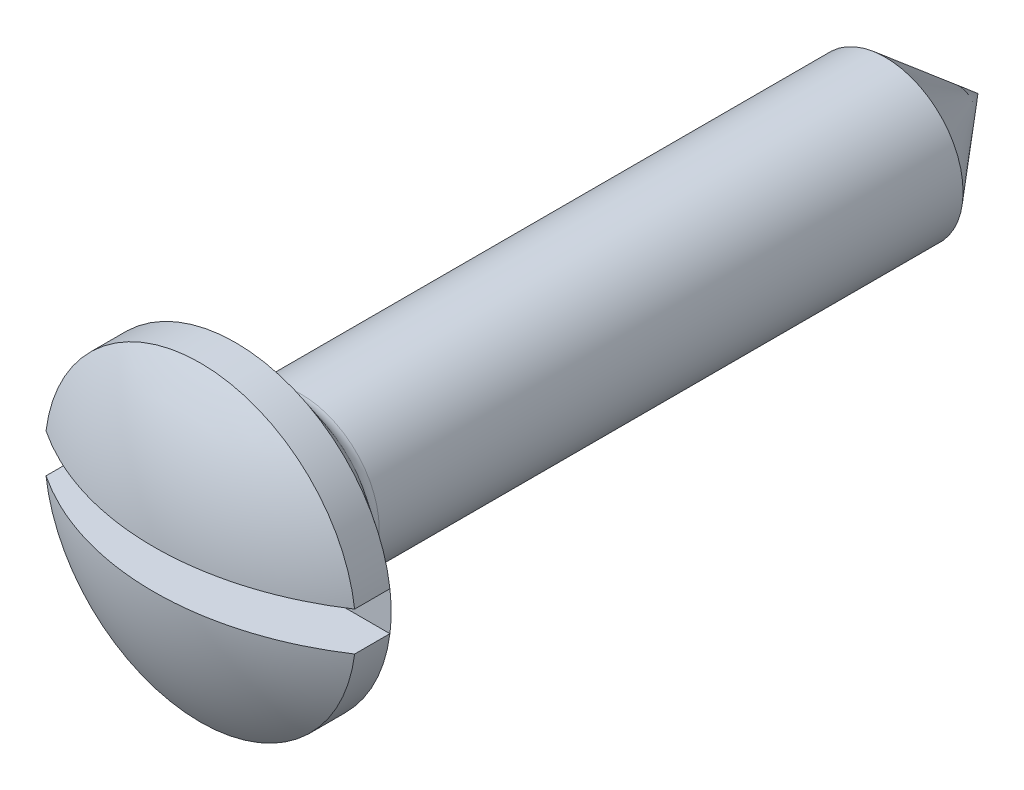
ISO-10303-21;
HEADER;
FILE_DESCRIPTION(('STEP AP214'),'2;1');
FILE_NAME('part.step','',(''),(''),'','','');
FILE_SCHEMA(('AUTOMOTIVE_DESIGN { 1 0 10303 214 1 1 1 1 }'));
ENDSEC;
DATA;
#1=APPLICATION_CONTEXT('core data for automotive mechanical design processes');
#2=APPLICATION_PROTOCOL_DEFINITION('international standard','automotive_design',2000,#1);
#3=PRODUCT_CONTEXT('',#1,'mechanical');
#4=PRODUCT('Part','Part','',(#3));
#5=PRODUCT_RELATED_PRODUCT_CATEGORY('part','',(#4));
#6=PRODUCT_DEFINITION_FORMATION('','',#4);
#7=PRODUCT_DEFINITION_CONTEXT('part definition',#1,'design');
#8=PRODUCT_DEFINITION('design','',#6,#7);
#9=PRODUCT_DEFINITION_SHAPE('','',#8);
#10=(LENGTH_UNIT() NAMED_UNIT(*) SI_UNIT(.MILLI.,.METRE.));
#11=(NAMED_UNIT(*) PLANE_ANGLE_UNIT() SI_UNIT($,.RADIAN.));
#12=(NAMED_UNIT(*) SI_UNIT($,.STERADIAN.) SOLID_ANGLE_UNIT());
#13=UNCERTAINTY_MEASURE_WITH_UNIT(LENGTH_MEASURE(1.E-05),#10,'distance_accuracy_value','');
#14=(GEOMETRIC_REPRESENTATION_CONTEXT(3) GLOBAL_UNCERTAINTY_ASSIGNED_CONTEXT((#13)) GLOBAL_UNIT_ASSIGNED_CONTEXT((#10,
#11,#12)) REPRESENTATION_CONTEXT('',''));
#15=CARTESIAN_POINT('',(0.,0.,0.));
#16=DIRECTION('',(0.,0.,1.));
#17=DIRECTION('',(1.,0.,0.));
#18=AXIS2_PLACEMENT_3D('',#15,#16,#17);
#19=CARTESIAN_POINT('',(0.,0.,-3.6));
#20=DIRECTION('',(0.,0.,1.));
#21=DIRECTION('',(0.,1.,0.));
#22=AXIS2_PLACEMENT_3D('',#19,#20,#21);
#23=SPHERICAL_SURFACE('',#22,3.6);
#24=CARTESIAN_POINT('',(0.,0.,-0.606674090580846));
#25=DIRECTION('',(0.,0.,1.));
#26=DIRECTION('',(1.,0.,0.));
#27=AXIS2_PLACEMENT_3D('',#24,#25,#26);
#28=CIRCLE('',#27,2.);
#29=CARTESIAN_POINT('',(1.98431348329844,0.250000000000002,-0.606674090580846));
#30=VERTEX_POINT('',#29);
#31=CARTESIAN_POINT('',(-1.98431348329844,0.250000000000001,-0.606674090580846));
#32=VERTEX_POINT('',#31);
#33=EDGE_CURVE('E11',#30,#32,#28,.T.);
#34=ORIENTED_EDGE('',*,*,#33,.T.);
#35=CARTESIAN_POINT('',(0.,0.250000000000001,-3.6));
#36=DIRECTION('',(0.,1.,0.));
#37=DIRECTION('',(-1.,0.,0.));
#38=AXIS2_PLACEMENT_3D('',#35,#36,#37);
#39=CIRCLE('',#38,3.59130895357111);
#40=EDGE_CURVE('E104',#32,#30,#39,.T.);
#41=ORIENTED_EDGE('',*,*,#40,.T.);
#42=EDGE_LOOP('',(#34,#41));
#43=FACE_BOUND('',#42,.T.);
#44=ADVANCED_FACE('F39',(#43),#23,.T.);
#45=CARTESIAN_POINT('',(0.,0.,0.));
#46=DIRECTION('',(0.,0.,1.));
#47=DIRECTION('',(1.,0.,0.));
#48=AXIS2_PLACEMENT_3D('',#45,#46,#47);
#49=CYLINDRICAL_SURFACE('',#48,2.);
#50=CARTESIAN_POINT('',(0.,0.,-1.06));
#51=DIRECTION('',(0.,0.,1.));
#52=DIRECTION('',(1.,0.,0.));
#53=AXIS2_PLACEMENT_3D('',#50,#51,#52);
#54=CIRCLE('',#53,2.);
#55=CARTESIAN_POINT('',(1.98431348329844,0.250000000000002,-1.06));
#56=VERTEX_POINT('',#55);
#57=CARTESIAN_POINT('',(-1.98431348329844,0.250000000000001,-1.06));
#58=VERTEX_POINT('',#57);
#59=EDGE_CURVE('E90',#56,#58,#54,.T.);
#60=ORIENTED_EDGE('',*,*,#59,.T.);
#61=DIRECTION('',(0.,0.,1.));
#62=VECTOR('',#61,1.);
#63=CARTESIAN_POINT('',(-1.98431348329844,0.250000000000001,0.));
#64=LINE('',#63,#62);
#65=EDGE_CURVE('E97',#58,#32,#64,.T.);
#66=ORIENTED_EDGE('',*,*,#65,.T.);
#67=ORIENTED_EDGE('',*,*,#33,.F.);
#68=DIRECTION('',(0.,0.,1.));
#69=VECTOR('',#68,1.);
#70=CARTESIAN_POINT('',(1.98431348329844,0.250000000000002,0.));
#71=LINE('',#70,#69);
#72=EDGE_CURVE('E94',#30,#56,#71,.F.);
#73=ORIENTED_EDGE('',*,*,#72,.T.);
#74=EDGE_LOOP('',(#60,#66,#67,#73));
#75=FACE_BOUND('',#74,.T.);
#76=ADVANCED_FACE('F103',(#75),#49,.T.);
#77=CARTESIAN_POINT('',(-1.98431348329844,-0.250000000000001,-0.606674090580846));
#78=VERTEX_POINT('',#77);
#79=CARTESIAN_POINT('',(1.98431348329844,-0.250000000000002,-0.606674090580846));
#80=VERTEX_POINT('',#79);
#81=EDGE_CURVE('E47',#78,#80,#28,.T.);
#82=ORIENTED_EDGE('',*,*,#81,.T.);
#83=CARTESIAN_POINT('',(0.,-0.250000000000001,-3.6));
#84=DIRECTION('',(0.,-1.,0.));
#85=DIRECTION('',(1.,0.,0.));
#86=AXIS2_PLACEMENT_3D('',#83,#84,#85);
#87=CIRCLE('',#86,3.59130895357111);
#88=EDGE_CURVE('E126',#80,#78,#87,.T.);
#89=ORIENTED_EDGE('',*,*,#88,.T.);
#90=EDGE_LOOP('',(#82,#89));
#91=FACE_BOUND('',#90,.T.);
#92=ADVANCED_FACE('F41',(#91),#23,.T.);
#93=CARTESIAN_POINT('',(-1.98431348329844,-0.250000000000001,-1.06));
#94=VERTEX_POINT('',#93);
#95=CARTESIAN_POINT('',(1.98431348329844,-0.250000000000002,-1.06));
#96=VERTEX_POINT('',#95);
#97=EDGE_CURVE('E88',#94,#96,#54,.T.);
#98=ORIENTED_EDGE('',*,*,#97,.T.);
#99=DIRECTION('',(0.,0.,1.));
#100=VECTOR('',#99,1.);
#101=CARTESIAN_POINT('',(1.98431348329844,-0.250000000000002,0.));
#102=LINE('',#101,#100);
#103=EDGE_CURVE('E105',#96,#80,#102,.T.);
#104=ORIENTED_EDGE('',*,*,#103,.T.);
#105=ORIENTED_EDGE('',*,*,#81,.F.);
#106=DIRECTION('',(0.,0.,1.));
#107=VECTOR('',#106,1.);
#108=CARTESIAN_POINT('',(-1.98431348329844,-0.250000000000001,0.));
#109=LINE('',#108,#107);
#110=EDGE_CURVE('E98',#78,#94,#109,.F.);
#111=ORIENTED_EDGE('',*,*,#110,.T.);
#112=EDGE_LOOP('',(#98,#104,#105,#111));
#113=FACE_BOUND('',#112,.T.);
#114=ADVANCED_FACE('F133',(#113),#49,.T.);
#115=CARTESIAN_POINT('',(0.,0.,-1.74668525653327));
#116=DIRECTION('',(0.,0.,1.));
#117=DIRECTION('',(1.,0.,0.));
#118=AXIS2_PLACEMENT_3D('',#115,#116,#117);
#119=CONICAL_SURFACE('',#118,1.08034138964284,0.929427200379356);
#120=ORIENTED_EDGE('',*,*,#59,.F.);
#121=EDGE_CURVE('E79',#96,#56,#54,.T.);
#122=ORIENTED_EDGE('',*,*,#121,.F.);
#123=ORIENTED_EDGE('',*,*,#97,.F.);
#124=EDGE_CURVE('E109',#58,#94,#54,.T.);
#125=ORIENTED_EDGE('',*,*,#124,.F.);
#126=EDGE_LOOP('',(#120,#122,#123,#125));
#127=FACE_BOUND('',#126,.T.);
#128=CARTESIAN_POINT('',(0.,0.,-1.74668525653327));
#129=DIRECTION('',(0.,0.,1.));
#130=DIRECTION('',(1.,0.,0.));
#131=AXIS2_PLACEMENT_3D('',#128,#129,#130);
#132=CIRCLE('',#131,1.08034138964284);
#133=CARTESIAN_POINT('',(1.08034138964284,0.,-1.74668525653327));
#134=VERTEX_POINT('',#133);
#135=EDGE_CURVE('E89',#134,#134,#132,.T.);
#136=ORIENTED_EDGE('',*,*,#135,.T.);
#137=EDGE_LOOP('',(#136));
#138=FACE_BOUND('',#137,.T.);
#139=ADVANCED_FACE('F107',(#127,#138),#119,.T.);
#140=CARTESIAN_POINT('',(0.,0.,-1.90694073059702));
#141=DIRECTION('',(0.,0.,1.));
#142=DIRECTION('',(1.,0.,0.));
#143=AXIS2_PLACEMENT_3D('',#140,#141,#142);
#144=TOROIDAL_SURFACE('',#143,1.19999999999999,0.2);
#145=ORIENTED_EDGE('',*,*,#135,.F.);
#146=EDGE_LOOP('',(#145));
#147=FACE_BOUND('',#146,.T.);
#148=CARTESIAN_POINT('',(0.,0.,-1.90694073059702));
#149=DIRECTION('',(0.,0.,1.));
#150=DIRECTION('',(1.,0.,0.));
#151=AXIS2_PLACEMENT_3D('',#148,#149,#150);
#152=CIRCLE('',#151,0.999999999999986);
#153=CARTESIAN_POINT('',(0.999999999999986,0.,-1.90694073059702));
#154=VERTEX_POINT('',#153);
#155=EDGE_CURVE('E115',#154,#154,#152,.T.);
#156=ORIENTED_EDGE('',*,*,#155,.T.);
#157=EDGE_LOOP('',(#156));
#158=FACE_BOUND('',#157,.T.);
#159=ADVANCED_FACE('F171',(#147,#158),#144,.F.);
#160=CARTESIAN_POINT('',(0.,0.,0.));
#161=DIRECTION('',(0.,0.,1.));
#162=DIRECTION('',(1.,0.,0.));
#163=AXIS2_PLACEMENT_3D('',#160,#161,#162);
#164=CYLINDRICAL_SURFACE('',#163,0.999999999999987);
#165=ORIENTED_EDGE('',*,*,#155,.F.);
#166=EDGE_LOOP('',(#165));
#167=FACE_BOUND('',#166,.T.);
#168=CARTESIAN_POINT('',(0.,0.,-9.41492049798663));
#169=DIRECTION('',(0.,0.,1.));
#170=DIRECTION('',(1.,0.,0.));
#171=AXIS2_PLACEMENT_3D('',#168,#169,#170);
#172=CIRCLE('',#171,0.999999999999987);
#173=CARTESIAN_POINT('',(0.999999999999987,0.,-9.41492049798663));
#174=VERTEX_POINT('',#173);
#175=EDGE_CURVE('E118',#174,#174,#172,.T.);
#176=ORIENTED_EDGE('',*,*,#175,.T.);
#177=EDGE_LOOP('',(#176));
#178=FACE_BOUND('',#177,.T.);
#179=ADVANCED_FACE('F205',(#167,#178),#164,.T.);
#180=CARTESIAN_POINT('',(0.,0.,-10.6066740905808));
#181=DIRECTION('',(0.,0.,1.));
#182=DIRECTION('',(1.,0.,0.));
#183=AXIS2_PLACEMENT_3D('',#180,#181,#182);
#184=CONICAL_SURFACE('',#183,0.,0.698131700797724);
#185=ORIENTED_EDGE('',*,*,#175,.F.);
#186=EDGE_LOOP('',(#185));
#187=FACE_BOUND('',#186,.T.);
#188=CARTESIAN_POINT('',(0.,0.,-10.6066740905808));
#189=VERTEX_POINT('',#188);
#190=VERTEX_LOOP('',#189);
#191=FACE_BOUND('',#190,.T.);
#192=ADVANCED_FACE('F182',(#187,#191),#184,.T.);
#193=CARTESIAN_POINT('',(5.,0.250000000000003,-1.06));
#194=DIRECTION('',(0.,1.,0.));
#195=DIRECTION('',(-1.,0.,0.));
#196=AXIS2_PLACEMENT_3D('',#193,#194,#195);
#197=PLANE('',#196);
#198=DIRECTION('',(-1.,0.,0.));
#199=VECTOR('',#198,1.);
#200=CARTESIAN_POINT('',(5.,0.250000000000003,-1.06));
#201=LINE('',#200,#199);
#202=EDGE_CURVE('E82',#56,#58,#201,.T.);
#203=ORIENTED_EDGE('',*,*,#202,.F.);
#204=ORIENTED_EDGE('',*,*,#72,.F.);
#205=ORIENTED_EDGE('',*,*,#40,.F.);
#206=ORIENTED_EDGE('',*,*,#65,.F.);
#207=EDGE_LOOP('',(#203,#204,#205,#206));
#208=FACE_BOUND('',#207,.T.);
#209=ADVANCED_FACE('F93',(#208),#197,.F.);
#210=CARTESIAN_POINT('',(-5.,-0.25,-1.06));
#211=DIRECTION('',(0.,-1.,0.));
#212=DIRECTION('',(1.,0.,0.));
#213=AXIS2_PLACEMENT_3D('',#210,#211,#212);
#214=PLANE('',#213);
#215=DIRECTION('',(1.,0.,0.));
#216=VECTOR('',#215,1.);
#217=CARTESIAN_POINT('',(-5.,-0.25,-1.06));
#218=LINE('',#217,#216);
#219=EDGE_CURVE('E54',#94,#96,#218,.T.);
#220=ORIENTED_EDGE('',*,*,#219,.F.);
#221=ORIENTED_EDGE('',*,*,#110,.F.);
#222=ORIENTED_EDGE('',*,*,#88,.F.);
#223=ORIENTED_EDGE('',*,*,#103,.F.);
#224=EDGE_LOOP('',(#220,#221,#222,#223));
#225=FACE_BOUND('',#224,.T.);
#226=ADVANCED_FACE('F135',(#225),#214,.F.);
#227=CARTESIAN_POINT('',(-5.,-0.25,-1.06));
#228=DIRECTION('',(0.,0.,1.));
#229=DIRECTION('',(1.,0.,0.));
#230=AXIS2_PLACEMENT_3D('',#227,#228,#229);
#231=PLANE('',#230);
#232=ORIENTED_EDGE('',*,*,#124,.T.);
#233=ORIENTED_EDGE('',*,*,#219,.T.);
#234=ORIENTED_EDGE('',*,*,#121,.T.);
#235=ORIENTED_EDGE('',*,*,#202,.T.);
#236=EDGE_LOOP('',(#232,#233,#234,#235));
#237=FACE_BOUND('',#236,.T.);
#238=ADVANCED_FACE('F81',(#237),#231,.T.);
#239=CLOSED_SHELL('',(#44,#76,#92,#114,#139,#159,#179,#192,#209,#226,#238));
#240=MANIFOLD_SOLID_BREP('B2',#239);
#241=ADVANCED_BREP_SHAPE_REPRESENTATION('',(#18,#240),#14);
#242=SHAPE_DEFINITION_REPRESENTATION(#9,#241);
ENDSEC;
END-ISO-10303-21;
